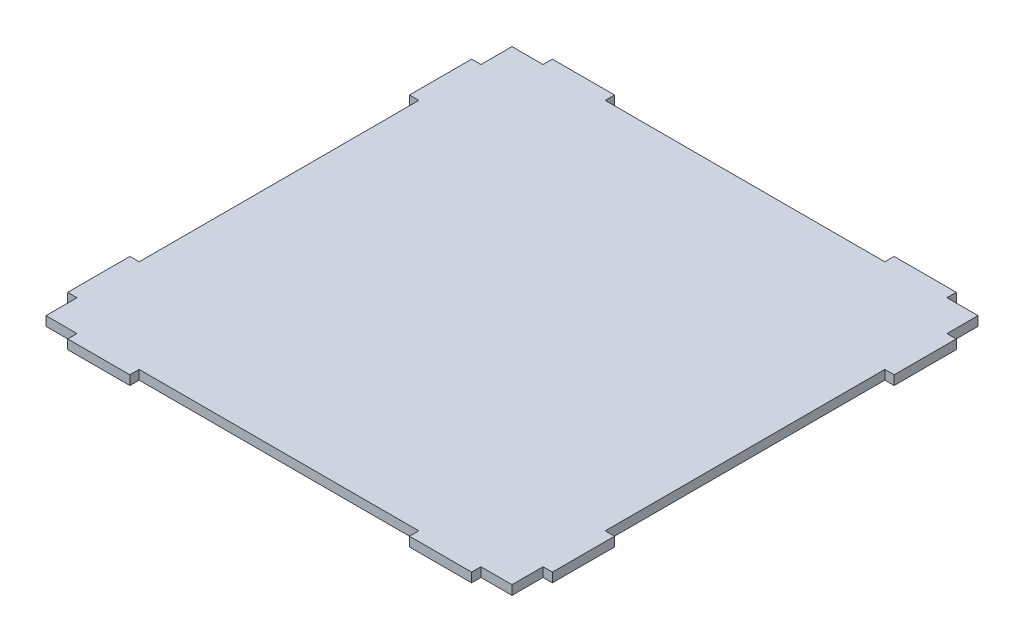
ISO-10303-21;
HEADER;
FILE_DESCRIPTION(('STEP AP214'),'2;1');
FILE_NAME('part.step','',(''),(''),'','','');
FILE_SCHEMA(('AUTOMOTIVE_DESIGN { 1 0 10303 214 1 1 1 1 }'));
ENDSEC;
DATA;
#1=APPLICATION_CONTEXT('core data for automotive mechanical design processes');
#2=APPLICATION_PROTOCOL_DEFINITION('international standard','automotive_design',2000,#1);
#3=PRODUCT_CONTEXT('',#1,'mechanical');
#4=PRODUCT('Part','Part','',(#3));
#5=PRODUCT_RELATED_PRODUCT_CATEGORY('part','',(#4));
#6=PRODUCT_DEFINITION_FORMATION('','',#4);
#7=PRODUCT_DEFINITION_CONTEXT('part definition',#1,'design');
#8=PRODUCT_DEFINITION('design','',#6,#7);
#9=PRODUCT_DEFINITION_SHAPE('','',#8);
#10=(LENGTH_UNIT() NAMED_UNIT(*) SI_UNIT(.MILLI.,.METRE.));
#11=(NAMED_UNIT(*) PLANE_ANGLE_UNIT() SI_UNIT($,.RADIAN.));
#12=(NAMED_UNIT(*) SI_UNIT($,.STERADIAN.) SOLID_ANGLE_UNIT());
#13=UNCERTAINTY_MEASURE_WITH_UNIT(LENGTH_MEASURE(1.E-05),#10,'distance_accuracy_value','');
#14=(GEOMETRIC_REPRESENTATION_CONTEXT(3) GLOBAL_UNCERTAINTY_ASSIGNED_CONTEXT((#13)) GLOBAL_UNIT_ASSIGNED_CONTEXT((#10,
#11,#12)) REPRESENTATION_CONTEXT('',''));
#15=CARTESIAN_POINT('',(0.,0.,0.));
#16=DIRECTION('',(0.,0.,1.));
#17=DIRECTION('',(1.,0.,0.));
#18=AXIS2_PLACEMENT_3D('',#15,#16,#17);
#19=CARTESIAN_POINT('',(0.,3.,0.));
#20=DIRECTION('',(-1.,0.,0.));
#21=DIRECTION('',(0.,0.,1.));
#22=AXIS2_PLACEMENT_3D('',#19,#20,#21);
#23=PLANE('',#22);
#24=DIRECTION('',(0.,0.,-1.));
#25=VECTOR('',#24,1.);
#26=CARTESIAN_POINT('',(0.,0.,0.));
#27=LINE('',#26,#25);
#28=CARTESIAN_POINT('',(0.,0.,-140.));
#29=VERTEX_POINT('',#28);
#30=CARTESIAN_POINT('',(0.,0.,-150.));
#31=VERTEX_POINT('',#30);
#32=EDGE_CURVE('E475',#29,#31,#27,.T.);
#33=ORIENTED_EDGE('',*,*,#32,.F.);
#34=DIRECTION('',(0.,-1.,0.));
#35=VECTOR('',#34,1.);
#36=CARTESIAN_POINT('',(0.,3.,-140.));
#37=LINE('',#36,#35);
#38=CARTESIAN_POINT('',(0.,3.,-140.));
#39=VERTEX_POINT('',#38);
#40=EDGE_CURVE('E49',#39,#29,#37,.T.);
#41=ORIENTED_EDGE('',*,*,#40,.F.);
#42=DIRECTION('',(0.,0.,-1.));
#43=VECTOR('',#42,1.);
#44=CARTESIAN_POINT('',(0.,3.,0.));
#45=LINE('',#44,#43);
#46=CARTESIAN_POINT('',(0.,3.,-150.));
#47=VERTEX_POINT('',#46);
#48=EDGE_CURVE('E480',#39,#47,#45,.T.);
#49=ORIENTED_EDGE('',*,*,#48,.T.);
#50=DIRECTION('',(0.,-1.,0.));
#51=VECTOR('',#50,1.);
#52=CARTESIAN_POINT('',(0.,3.,-150.));
#53=LINE('',#52,#51);
#54=EDGE_CURVE('E36',#47,#31,#53,.T.);
#55=ORIENTED_EDGE('',*,*,#54,.T.);
#56=EDGE_LOOP('',(#33,#41,#49,#55));
#57=FACE_BOUND('',#56,.T.);
#58=ADVANCED_FACE('F33',(#57),#23,.T.);
#59=CARTESIAN_POINT('',(0.,3.,-30.));
#60=VERTEX_POINT('',#59);
#61=CARTESIAN_POINT('',(0.,3.,-120.));
#62=VERTEX_POINT('',#61);
#63=EDGE_CURVE('E479',#60,#62,#45,.T.);
#64=ORIENTED_EDGE('',*,*,#63,.T.);
#65=DIRECTION('',(0.,1.,0.));
#66=VECTOR('',#65,1.);
#67=CARTESIAN_POINT('',(0.,3.,-120.));
#68=LINE('',#67,#66);
#69=CARTESIAN_POINT('',(0.,0.,-120.));
#70=VERTEX_POINT('',#69);
#71=EDGE_CURVE('E284',#70,#62,#68,.T.);
#72=ORIENTED_EDGE('',*,*,#71,.F.);
#73=CARTESIAN_POINT('',(0.,0.,-30.));
#74=VERTEX_POINT('',#73);
#75=EDGE_CURVE('E498',#74,#70,#27,.T.);
#76=ORIENTED_EDGE('',*,*,#75,.F.);
#77=DIRECTION('',(0.,-1.,0.));
#78=VECTOR('',#77,1.);
#79=CARTESIAN_POINT('',(0.,3.,-30.));
#80=LINE('',#79,#78);
#81=EDGE_CURVE('E453',#60,#74,#80,.T.);
#82=ORIENTED_EDGE('',*,*,#81,.F.);
#83=EDGE_LOOP('',(#64,#72,#76,#82));
#84=FACE_BOUND('',#83,.T.);
#85=ADVANCED_FACE('F532',(#84),#23,.T.);
#86=CARTESIAN_POINT('',(0.,3.,-150.));
#87=DIRECTION('',(0.,0.,-1.));
#88=DIRECTION('',(-1.,0.,0.));
#89=AXIS2_PLACEMENT_3D('',#86,#87,#88);
#90=PLANE('',#89);
#91=DIRECTION('',(1.,0.,0.));
#92=VECTOR('',#91,1.);
#93=CARTESIAN_POINT('',(0.,3.,-150.));
#94=LINE('',#93,#92);
#95=CARTESIAN_POINT('',(10.,3.,-150.));
#96=VERTEX_POINT('',#95);
#97=EDGE_CURVE('E481',#47,#96,#94,.T.);
#98=ORIENTED_EDGE('',*,*,#97,.T.);
#99=DIRECTION('',(0.,1.,0.));
#100=VECTOR('',#99,1.);
#101=CARTESIAN_POINT('',(10.,3.,-150.));
#102=LINE('',#101,#100);
#103=CARTESIAN_POINT('',(10.,0.,-150.));
#104=VERTEX_POINT('',#103);
#105=EDGE_CURVE('E287',#104,#96,#102,.T.);
#106=ORIENTED_EDGE('',*,*,#105,.F.);
#107=DIRECTION('',(1.,0.,0.));
#108=VECTOR('',#107,1.);
#109=CARTESIAN_POINT('',(0.,0.,-150.));
#110=LINE('',#109,#108);
#111=EDGE_CURVE('E499',#31,#104,#110,.T.);
#112=ORIENTED_EDGE('',*,*,#111,.F.);
#113=ORIENTED_EDGE('',*,*,#54,.F.);
#114=EDGE_LOOP('',(#98,#106,#112,#113));
#115=FACE_BOUND('',#114,.T.);
#116=ADVANCED_FACE('F524',(#115),#90,.T.);
#117=CARTESIAN_POINT('',(30.,0.,-150.));
#118=VERTEX_POINT('',#117);
#119=CARTESIAN_POINT('',(120.,0.,-150.));
#120=VERTEX_POINT('',#119);
#121=EDGE_CURVE('E503',#118,#120,#110,.T.);
#122=ORIENTED_EDGE('',*,*,#121,.F.);
#123=DIRECTION('',(0.,-1.,0.));
#124=VECTOR('',#123,1.);
#125=CARTESIAN_POINT('',(30.,3.,-150.));
#126=LINE('',#125,#124);
#127=CARTESIAN_POINT('',(30.,3.,-150.));
#128=VERTEX_POINT('',#127);
#129=EDGE_CURVE('E290',#128,#118,#126,.T.);
#130=ORIENTED_EDGE('',*,*,#129,.F.);
#131=CARTESIAN_POINT('',(120.,3.,-150.));
#132=VERTEX_POINT('',#131);
#133=EDGE_CURVE('E485',#128,#132,#94,.T.);
#134=ORIENTED_EDGE('',*,*,#133,.T.);
#135=DIRECTION('',(0.,1.,0.));
#136=VECTOR('',#135,1.);
#137=CARTESIAN_POINT('',(120.,3.,-150.));
#138=LINE('',#137,#136);
#139=EDGE_CURVE('E318',#120,#132,#138,.T.);
#140=ORIENTED_EDGE('',*,*,#139,.F.);
#141=EDGE_LOOP('',(#122,#130,#134,#140));
#142=FACE_BOUND('',#141,.T.);
#143=ADVANCED_FACE('F609',(#142),#90,.T.);
#144=DIRECTION('',(0.,-1.,0.));
#145=VECTOR('',#144,1.);
#146=CARTESIAN_POINT('',(140.,3.,-150.));
#147=LINE('',#146,#145);
#148=CARTESIAN_POINT('',(140.,3.,-150.));
#149=VERTEX_POINT('',#148);
#150=CARTESIAN_POINT('',(140.,0.,-150.));
#151=VERTEX_POINT('',#150);
#152=EDGE_CURVE('E313',#149,#151,#147,.T.);
#153=ORIENTED_EDGE('',*,*,#152,.F.);
#154=CARTESIAN_POINT('',(150.,3.,-150.));
#155=VERTEX_POINT('',#154);
#156=EDGE_CURVE('E478',#149,#155,#94,.T.);
#157=ORIENTED_EDGE('',*,*,#156,.T.);
#158=DIRECTION('',(0.,-1.,0.));
#159=VECTOR('',#158,1.);
#160=CARTESIAN_POINT('',(150.,3.,-150.));
#161=LINE('',#160,#159);
#162=CARTESIAN_POINT('',(150.,0.,-150.));
#163=VERTEX_POINT('',#162);
#164=EDGE_CURVE('E512',#155,#163,#161,.T.);
#165=ORIENTED_EDGE('',*,*,#164,.T.);
#166=EDGE_CURVE('E497',#151,#163,#110,.T.);
#167=ORIENTED_EDGE('',*,*,#166,.F.);
#168=EDGE_LOOP('',(#153,#157,#165,#167));
#169=FACE_BOUND('',#168,.T.);
#170=ADVANCED_FACE('F610',(#169),#90,.T.);
#171=CARTESIAN_POINT('',(150.,3.,0.));
#172=DIRECTION('',(-1.,0.,0.));
#173=DIRECTION('',(0.,0.,1.));
#174=AXIS2_PLACEMENT_3D('',#171,#172,#173);
#175=PLANE('',#174);
#176=DIRECTION('',(0.,1.,0.));
#177=VECTOR('',#176,1.);
#178=CARTESIAN_POINT('',(150.,3.,-140.));
#179=LINE('',#178,#177);
#180=CARTESIAN_POINT('',(150.,0.,-140.));
#181=VERTEX_POINT('',#180);
#182=CARTESIAN_POINT('',(150.,3.,-140.));
#183=VERTEX_POINT('',#182);
#184=EDGE_CURVE('E340',#181,#183,#179,.T.);
#185=ORIENTED_EDGE('',*,*,#184,.F.);
#186=DIRECTION('',(0.,0.,-1.));
#187=VECTOR('',#186,1.);
#188=CARTESIAN_POINT('',(150.,0.,0.));
#189=LINE('',#188,#187);
#190=EDGE_CURVE('E502',#181,#163,#189,.T.);
#191=ORIENTED_EDGE('',*,*,#190,.T.);
#192=ORIENTED_EDGE('',*,*,#164,.F.);
#193=DIRECTION('',(0.,0.,-1.));
#194=VECTOR('',#193,1.);
#195=CARTESIAN_POINT('',(150.,3.,0.));
#196=LINE('',#195,#194);
#197=EDGE_CURVE('E484',#183,#155,#196,.T.);
#198=ORIENTED_EDGE('',*,*,#197,.F.);
#199=EDGE_LOOP('',(#185,#191,#192,#198));
#200=FACE_BOUND('',#199,.T.);
#201=ADVANCED_FACE('F607',(#200),#175,.F.);
#202=DIRECTION('',(0.,-1.,0.));
#203=VECTOR('',#202,1.);
#204=CARTESIAN_POINT('',(150.,3.,-120.));
#205=LINE('',#204,#203);
#206=CARTESIAN_POINT('',(150.,3.,-120.));
#207=VERTEX_POINT('',#206);
#208=CARTESIAN_POINT('',(150.,0.,-120.));
#209=VERTEX_POINT('',#208);
#210=EDGE_CURVE('E345',#207,#209,#205,.T.);
#211=ORIENTED_EDGE('',*,*,#210,.F.);
#212=CARTESIAN_POINT('',(150.,3.,-30.));
#213=VERTEX_POINT('',#212);
#214=EDGE_CURVE('E490',#213,#207,#196,.T.);
#215=ORIENTED_EDGE('',*,*,#214,.F.);
#216=DIRECTION('',(0.,1.,0.));
#217=VECTOR('',#216,1.);
#218=CARTESIAN_POINT('',(150.,3.,-30.));
#219=LINE('',#218,#217);
#220=CARTESIAN_POINT('',(150.,0.,-30.));
#221=VERTEX_POINT('',#220);
#222=EDGE_CURVE('E372',#221,#213,#219,.T.);
#223=ORIENTED_EDGE('',*,*,#222,.F.);
#224=EDGE_CURVE('E507',#221,#209,#189,.T.);
#225=ORIENTED_EDGE('',*,*,#224,.T.);
#226=EDGE_LOOP('',(#211,#215,#223,#225));
#227=FACE_BOUND('',#226,.T.);
#228=ADVANCED_FACE('F605',(#227),#175,.F.);
#229=DIRECTION('',(0.,-1.,0.));
#230=VECTOR('',#229,1.);
#231=CARTESIAN_POINT('',(150.,3.,-10.));
#232=LINE('',#231,#230);
#233=CARTESIAN_POINT('',(150.,3.,-10.));
#234=VERTEX_POINT('',#233);
#235=CARTESIAN_POINT('',(150.,0.,-10.));
#236=VERTEX_POINT('',#235);
#237=EDGE_CURVE('E367',#234,#236,#232,.T.);
#238=ORIENTED_EDGE('',*,*,#237,.F.);
#239=CARTESIAN_POINT('',(150.,3.,0.));
#240=VERTEX_POINT('',#239);
#241=EDGE_CURVE('E486',#240,#234,#196,.T.);
#242=ORIENTED_EDGE('',*,*,#241,.F.);
#243=DIRECTION('',(0.,-1.,0.));
#244=VECTOR('',#243,1.);
#245=CARTESIAN_POINT('',(150.,3.,0.));
#246=LINE('',#245,#244);
#247=CARTESIAN_POINT('',(150.,0.,0.));
#248=VERTEX_POINT('',#247);
#249=EDGE_CURVE('E41',#240,#248,#246,.T.);
#250=ORIENTED_EDGE('',*,*,#249,.T.);
#251=EDGE_CURVE('E504',#248,#236,#189,.T.);
#252=ORIENTED_EDGE('',*,*,#251,.T.);
#253=EDGE_LOOP('',(#238,#242,#250,#252));
#254=FACE_BOUND('',#253,.T.);
#255=ADVANCED_FACE('F603',(#254),#175,.F.);
#256=CARTESIAN_POINT('',(0.,3.,0.));
#257=DIRECTION('',(0.,0.,-1.));
#258=DIRECTION('',(-1.,0.,0.));
#259=AXIS2_PLACEMENT_3D('',#256,#257,#258);
#260=PLANE('',#259);
#261=DIRECTION('',(0.,1.,0.));
#262=VECTOR('',#261,1.);
#263=CARTESIAN_POINT('',(140.,3.,0.));
#264=LINE('',#263,#262);
#265=CARTESIAN_POINT('',(140.,0.,0.));
#266=VERTEX_POINT('',#265);
#267=CARTESIAN_POINT('',(140.,3.,0.));
#268=VERTEX_POINT('',#267);
#269=EDGE_CURVE('E394',#266,#268,#264,.T.);
#270=ORIENTED_EDGE('',*,*,#269,.F.);
#271=DIRECTION('',(1.,0.,0.));
#272=VECTOR('',#271,1.);
#273=CARTESIAN_POINT('',(0.,0.,0.));
#274=LINE('',#273,#272);
#275=EDGE_CURVE('E506',#266,#248,#274,.T.);
#276=ORIENTED_EDGE('',*,*,#275,.T.);
#277=ORIENTED_EDGE('',*,*,#249,.F.);
#278=DIRECTION('',(1.,0.,0.));
#279=VECTOR('',#278,1.);
#280=CARTESIAN_POINT('',(0.,3.,0.));
#281=LINE('',#280,#279);
#282=EDGE_CURVE('E489',#268,#240,#281,.T.);
#283=ORIENTED_EDGE('',*,*,#282,.F.);
#284=EDGE_LOOP('',(#270,#276,#277,#283));
#285=FACE_BOUND('',#284,.T.);
#286=ADVANCED_FACE('F576',(#285),#260,.F.);
#287=DIRECTION('',(0.,-1.,0.));
#288=VECTOR('',#287,1.);
#289=CARTESIAN_POINT('',(120.,3.,0.));
#290=LINE('',#289,#288);
#291=CARTESIAN_POINT('',(120.,3.,0.));
#292=VERTEX_POINT('',#291);
#293=CARTESIAN_POINT('',(120.,0.,0.));
#294=VERTEX_POINT('',#293);
#295=EDGE_CURVE('E399',#292,#294,#290,.T.);
#296=ORIENTED_EDGE('',*,*,#295,.F.);
#297=CARTESIAN_POINT('',(30.,3.,0.));
#298=VERTEX_POINT('',#297);
#299=EDGE_CURVE('E494',#298,#292,#281,.T.);
#300=ORIENTED_EDGE('',*,*,#299,.F.);
#301=DIRECTION('',(0.,1.,0.));
#302=VECTOR('',#301,1.);
#303=CARTESIAN_POINT('',(30.,3.,0.));
#304=LINE('',#303,#302);
#305=CARTESIAN_POINT('',(30.,0.,0.));
#306=VERTEX_POINT('',#305);
#307=EDGE_CURVE('E426',#306,#298,#304,.T.);
#308=ORIENTED_EDGE('',*,*,#307,.F.);
#309=EDGE_CURVE('E509',#306,#294,#274,.T.);
#310=ORIENTED_EDGE('',*,*,#309,.T.);
#311=EDGE_LOOP('',(#296,#300,#308,#310));
#312=FACE_BOUND('',#311,.T.);
#313=ADVANCED_FACE('F573',(#312),#260,.F.);
#314=DIRECTION('',(0.,-1.,0.));
#315=VECTOR('',#314,1.);
#316=CARTESIAN_POINT('',(10.,3.,0.));
#317=LINE('',#316,#315);
#318=CARTESIAN_POINT('',(10.,3.,0.));
#319=VERTEX_POINT('',#318);
#320=CARTESIAN_POINT('',(10.,0.,0.));
#321=VERTEX_POINT('',#320);
#322=EDGE_CURVE('E421',#319,#321,#317,.T.);
#323=ORIENTED_EDGE('',*,*,#322,.F.);
#324=CARTESIAN_POINT('',(0.,3.,0.));
#325=VERTEX_POINT('',#324);
#326=EDGE_CURVE('E491',#325,#319,#281,.T.);
#327=ORIENTED_EDGE('',*,*,#326,.F.);
#328=DIRECTION('',(0.,-1.,0.));
#329=VECTOR('',#328,1.);
#330=CARTESIAN_POINT('',(0.,3.,0.));
#331=LINE('',#330,#329);
#332=CARTESIAN_POINT('',(0.,0.,0.));
#333=VERTEX_POINT('',#332);
#334=EDGE_CURVE('E11',#325,#333,#331,.T.);
#335=ORIENTED_EDGE('',*,*,#334,.T.);
#336=EDGE_CURVE('E508',#333,#321,#274,.T.);
#337=ORIENTED_EDGE('',*,*,#336,.T.);
#338=EDGE_LOOP('',(#323,#327,#335,#337));
#339=FACE_BOUND('',#338,.T.);
#340=ADVANCED_FACE('F566',(#339),#260,.F.);
#341=DIRECTION('',(0.,1.,0.));
#342=VECTOR('',#341,1.);
#343=CARTESIAN_POINT('',(0.,3.,-10.));
#344=LINE('',#343,#342);
#345=CARTESIAN_POINT('',(0.,0.,-10.));
#346=VERTEX_POINT('',#345);
#347=CARTESIAN_POINT('',(0.,3.,-10.));
#348=VERTEX_POINT('',#347);
#349=EDGE_CURVE('E448',#346,#348,#344,.T.);
#350=ORIENTED_EDGE('',*,*,#349,.F.);
#351=EDGE_CURVE('E495',#333,#346,#27,.T.);
#352=ORIENTED_EDGE('',*,*,#351,.F.);
#353=ORIENTED_EDGE('',*,*,#334,.F.);
#354=EDGE_CURVE('E476',#325,#348,#45,.T.);
#355=ORIENTED_EDGE('',*,*,#354,.T.);
#356=EDGE_LOOP('',(#350,#352,#353,#355));
#357=FACE_BOUND('',#356,.T.);
#358=ADVANCED_FACE('F561',(#357),#23,.T.);
#359=CARTESIAN_POINT('',(0.,3.,0.));
#360=DIRECTION('',(0.,-1.,0.));
#361=DIRECTION('',(0.,0.,-1.));
#362=AXIS2_PLACEMENT_3D('',#359,#360,#361);
#363=PLANE('',#362);
#364=ORIENTED_EDGE('',*,*,#354,.F.);
#365=ORIENTED_EDGE('',*,*,#326,.T.);
#366=DIRECTION('',(0.,0.,-1.));
#367=VECTOR('',#366,1.);
#368=CARTESIAN_POINT('',(10.,3.,3.));
#369=LINE('',#368,#367);
#370=CARTESIAN_POINT('',(10.,3.,3.));
#371=VERTEX_POINT('',#370);
#372=EDGE_CURVE('E432',#371,#319,#369,.T.);
#373=ORIENTED_EDGE('',*,*,#372,.F.);
#374=DIRECTION('',(-1.,0.,0.));
#375=VECTOR('',#374,1.);
#376=CARTESIAN_POINT('',(10.,3.,3.));
#377=LINE('',#376,#375);
#378=CARTESIAN_POINT('',(30.,3.,3.));
#379=VERTEX_POINT('',#378);
#380=EDGE_CURVE('E430',#379,#371,#377,.T.);
#381=ORIENTED_EDGE('',*,*,#380,.F.);
#382=DIRECTION('',(0.,0.,-1.));
#383=VECTOR('',#382,1.);
#384=CARTESIAN_POINT('',(30.,3.,3.));
#385=LINE('',#384,#383);
#386=EDGE_CURVE('E439',#379,#298,#385,.T.);
#387=ORIENTED_EDGE('',*,*,#386,.T.);
#388=ORIENTED_EDGE('',*,*,#299,.T.);
#389=DIRECTION('',(0.,0.,-1.));
#390=VECTOR('',#389,1.);
#391=CARTESIAN_POINT('',(120.,3.,3.));
#392=LINE('',#391,#390);
#393=CARTESIAN_POINT('',(120.,3.,3.));
#394=VERTEX_POINT('',#393);
#395=EDGE_CURVE('E415',#394,#292,#392,.T.);
#396=ORIENTED_EDGE('',*,*,#395,.F.);
#397=DIRECTION('',(-1.,0.,0.));
#398=VECTOR('',#397,1.);
#399=CARTESIAN_POINT('',(140.,3.,3.));
#400=LINE('',#399,#398);
#401=CARTESIAN_POINT('',(140.,3.,3.));
#402=VERTEX_POINT('',#401);
#403=EDGE_CURVE('E398',#402,#394,#400,.T.);
#404=ORIENTED_EDGE('',*,*,#403,.F.);
#405=DIRECTION('',(0.,0.,-1.));
#406=VECTOR('',#405,1.);
#407=CARTESIAN_POINT('',(140.,3.,3.));
#408=LINE('',#407,#406);
#409=EDGE_CURVE('E418',#402,#268,#408,.T.);
#410=ORIENTED_EDGE('',*,*,#409,.T.);
#411=ORIENTED_EDGE('',*,*,#282,.T.);
#412=ORIENTED_EDGE('',*,*,#241,.T.);
#413=DIRECTION('',(-1.,0.,0.));
#414=VECTOR('',#413,1.);
#415=CARTESIAN_POINT('',(153.,3.,-10.));
#416=LINE('',#415,#414);
#417=CARTESIAN_POINT('',(153.,3.,-10.));
#418=VERTEX_POINT('',#417);
#419=EDGE_CURVE('E378',#418,#234,#416,.T.);
#420=ORIENTED_EDGE('',*,*,#419,.F.);
#421=DIRECTION('',(0.,0.,1.));
#422=VECTOR('',#421,1.);
#423=CARTESIAN_POINT('',(153.,3.,-10.));
#424=LINE('',#423,#422);
#425=CARTESIAN_POINT('',(153.,3.,-30.));
#426=VERTEX_POINT('',#425);
#427=EDGE_CURVE('E376',#426,#418,#424,.T.);
#428=ORIENTED_EDGE('',*,*,#427,.F.);
#429=DIRECTION('',(-1.,0.,0.));
#430=VECTOR('',#429,1.);
#431=CARTESIAN_POINT('',(153.,3.,-30.));
#432=LINE('',#431,#430);
#433=EDGE_CURVE('E385',#426,#213,#432,.T.);
#434=ORIENTED_EDGE('',*,*,#433,.T.);
#435=ORIENTED_EDGE('',*,*,#214,.T.);
#436=DIRECTION('',(-1.,0.,0.));
#437=VECTOR('',#436,1.);
#438=CARTESIAN_POINT('',(153.,3.,-120.));
#439=LINE('',#438,#437);
#440=CARTESIAN_POINT('',(153.,3.,-120.));
#441=VERTEX_POINT('',#440);
#442=EDGE_CURVE('E361',#441,#207,#439,.T.);
#443=ORIENTED_EDGE('',*,*,#442,.F.);
#444=DIRECTION('',(0.,0.,1.));
#445=VECTOR('',#444,1.);
#446=CARTESIAN_POINT('',(153.,3.,-140.));
#447=LINE('',#446,#445);
#448=CARTESIAN_POINT('',(153.,3.,-140.));
#449=VERTEX_POINT('',#448);
#450=EDGE_CURVE('E344',#449,#441,#447,.T.);
#451=ORIENTED_EDGE('',*,*,#450,.F.);
#452=DIRECTION('',(-1.,0.,0.));
#453=VECTOR('',#452,1.);
#454=CARTESIAN_POINT('',(153.,3.,-140.));
#455=LINE('',#454,#453);
#456=EDGE_CURVE('E364',#449,#183,#455,.T.);
#457=ORIENTED_EDGE('',*,*,#456,.T.);
#458=ORIENTED_EDGE('',*,*,#197,.T.);
#459=ORIENTED_EDGE('',*,*,#156,.F.);
#460=DIRECTION('',(0.,0.,1.));
#461=VECTOR('',#460,1.);
#462=CARTESIAN_POINT('',(140.,3.,-153.));
#463=LINE('',#462,#461);
#464=CARTESIAN_POINT('',(140.,3.,-153.));
#465=VERTEX_POINT('',#464);
#466=EDGE_CURVE('E324',#465,#149,#463,.T.);
#467=ORIENTED_EDGE('',*,*,#466,.F.);
#468=DIRECTION('',(1.,0.,0.));
#469=VECTOR('',#468,1.);
#470=CARTESIAN_POINT('',(140.,3.,-153.));
#471=LINE('',#470,#469);
#472=CARTESIAN_POINT('',(120.,3.,-153.));
#473=VERTEX_POINT('',#472);
#474=EDGE_CURVE('E322',#473,#465,#471,.T.);
#475=ORIENTED_EDGE('',*,*,#474,.F.);
#476=DIRECTION('',(0.,0.,1.));
#477=VECTOR('',#476,1.);
#478=CARTESIAN_POINT('',(120.,3.,-153.));
#479=LINE('',#478,#477);
#480=EDGE_CURVE('E331',#473,#132,#479,.T.);
#481=ORIENTED_EDGE('',*,*,#480,.T.);
#482=ORIENTED_EDGE('',*,*,#133,.F.);
#483=DIRECTION('',(0.,0.,1.));
#484=VECTOR('',#483,1.);
#485=CARTESIAN_POINT('',(30.,3.,-153.));
#486=LINE('',#485,#484);
#487=CARTESIAN_POINT('',(30.,3.,-153.));
#488=VERTEX_POINT('',#487);
#489=EDGE_CURVE('E309',#488,#128,#486,.T.);
#490=ORIENTED_EDGE('',*,*,#489,.F.);
#491=DIRECTION('',(1.,0.,0.));
#492=VECTOR('',#491,1.);
#493=CARTESIAN_POINT('',(10.,3.,-153.));
#494=LINE('',#493,#492);
#495=CARTESIAN_POINT('',(10.,3.,-153.));
#496=VERTEX_POINT('',#495);
#497=EDGE_CURVE('E299',#496,#488,#494,.T.);
#498=ORIENTED_EDGE('',*,*,#497,.F.);
#499=DIRECTION('',(0.,0.,1.));
#500=VECTOR('',#499,1.);
#501=CARTESIAN_POINT('',(10.,3.,-153.));
#502=LINE('',#501,#500);
#503=EDGE_CURVE('E311',#496,#96,#502,.T.);
#504=ORIENTED_EDGE('',*,*,#503,.T.);
#505=ORIENTED_EDGE('',*,*,#97,.F.);
#506=ORIENTED_EDGE('',*,*,#48,.F.);
#507=DIRECTION('',(1.,0.,0.));
#508=VECTOR('',#507,1.);
#509=CARTESIAN_POINT('',(-3.,3.,-140.));
#510=LINE('',#509,#508);
#511=CARTESIAN_POINT('',(-3.,3.,-140.));
#512=VERTEX_POINT('',#511);
#513=EDGE_CURVE('E544',#512,#39,#510,.T.);
#514=ORIENTED_EDGE('',*,*,#513,.F.);
#515=DIRECTION('',(0.,0.,-1.));
#516=VECTOR('',#515,1.);
#517=CARTESIAN_POINT('',(-3.,3.,-140.));
#518=LINE('',#517,#516);
#519=CARTESIAN_POINT('',(-3.,3.,-120.));
#520=VERTEX_POINT('',#519);
#521=EDGE_CURVE('E282',#520,#512,#518,.T.);
#522=ORIENTED_EDGE('',*,*,#521,.F.);
#523=DIRECTION('',(1.,0.,0.));
#524=VECTOR('',#523,1.);
#525=CARTESIAN_POINT('',(-3.,3.,-120.));
#526=LINE('',#525,#524);
#527=EDGE_CURVE('E292',#520,#62,#526,.T.);
#528=ORIENTED_EDGE('',*,*,#527,.T.);
#529=ORIENTED_EDGE('',*,*,#63,.F.);
#530=DIRECTION('',(1.,0.,0.));
#531=VECTOR('',#530,1.);
#532=CARTESIAN_POINT('',(-3.,3.,-30.));
#533=LINE('',#532,#531);
#534=CARTESIAN_POINT('',(-3.,3.,-30.));
#535=VERTEX_POINT('',#534);
#536=EDGE_CURVE('E469',#535,#60,#533,.T.);
#537=ORIENTED_EDGE('',*,*,#536,.F.);
#538=DIRECTION('',(0.,0.,-1.));
#539=VECTOR('',#538,1.);
#540=CARTESIAN_POINT('',(-3.,3.,-10.));
#541=LINE('',#540,#539);
#542=CARTESIAN_POINT('',(-3.,3.,-10.));
#543=VERTEX_POINT('',#542);
#544=EDGE_CURVE('E452',#543,#535,#541,.T.);
#545=ORIENTED_EDGE('',*,*,#544,.F.);
#546=DIRECTION('',(1.,0.,0.));
#547=VECTOR('',#546,1.);
#548=CARTESIAN_POINT('',(-3.,3.,-10.));
#549=LINE('',#548,#547);
#550=EDGE_CURVE('E472',#543,#348,#549,.T.);
#551=ORIENTED_EDGE('',*,*,#550,.T.);
#552=EDGE_LOOP('',(#364,#365,#373,#381,#387,#388,#396,#404,#410,#411,#412,#420,#428,#434,#435,
#443,#451,#457,#458,#459,#467,#475,#481,#482,#490,#498,#504,#505,#506,#514,#522,#528,#529,#537,
#545,#551));
#553=FACE_BOUND('',#552,.T.);
#554=ADVANCED_FACE('F540',(#553),#363,.F.);
#555=CARTESIAN_POINT('',(0.,0.,0.));
#556=DIRECTION('',(0.,-1.,0.));
#557=DIRECTION('',(0.,0.,-1.));
#558=AXIS2_PLACEMENT_3D('',#555,#556,#557);
#559=PLANE('',#558);
#560=ORIENTED_EDGE('',*,*,#351,.T.);
#561=DIRECTION('',(1.,0.,0.));
#562=VECTOR('',#561,1.);
#563=CARTESIAN_POINT('',(-3.,0.,-10.));
#564=LINE('',#563,#562);
#565=CARTESIAN_POINT('',(-3.,0.,-10.));
#566=VERTEX_POINT('',#565);
#567=EDGE_CURVE('E459',#566,#346,#564,.T.);
#568=ORIENTED_EDGE('',*,*,#567,.F.);
#569=DIRECTION('',(0.,0.,1.));
#570=VECTOR('',#569,1.);
#571=CARTESIAN_POINT('',(-3.,0.,-10.));
#572=LINE('',#571,#570);
#573=CARTESIAN_POINT('',(-3.,0.,-30.));
#574=VERTEX_POINT('',#573);
#575=EDGE_CURVE('E457',#574,#566,#572,.T.);
#576=ORIENTED_EDGE('',*,*,#575,.F.);
#577=DIRECTION('',(1.,0.,0.));
#578=VECTOR('',#577,1.);
#579=CARTESIAN_POINT('',(-3.,0.,-30.));
#580=LINE('',#579,#578);
#581=EDGE_CURVE('E466',#574,#74,#580,.T.);
#582=ORIENTED_EDGE('',*,*,#581,.T.);
#583=ORIENTED_EDGE('',*,*,#75,.T.);
#584=DIRECTION('',(1.,0.,0.));
#585=VECTOR('',#584,1.);
#586=CARTESIAN_POINT('',(-3.,0.,-120.));
#587=LINE('',#586,#585);
#588=CARTESIAN_POINT('',(-3.,0.,-120.));
#589=VERTEX_POINT('',#588);
#590=EDGE_CURVE('E273',#589,#70,#587,.T.);
#591=ORIENTED_EDGE('',*,*,#590,.F.);
#592=DIRECTION('',(0.,0.,1.));
#593=VECTOR('',#592,1.);
#594=CARTESIAN_POINT('',(-3.,0.,-140.));
#595=LINE('',#594,#593);
#596=CARTESIAN_POINT('',(-3.,0.,-140.));
#597=VERTEX_POINT('',#596);
#598=EDGE_CURVE('E266',#597,#589,#595,.T.);
#599=ORIENTED_EDGE('',*,*,#598,.F.);
#600=DIRECTION('',(1.,0.,0.));
#601=VECTOR('',#600,1.);
#602=CARTESIAN_POINT('',(-3.,0.,-140.));
#603=LINE('',#602,#601);
#604=EDGE_CURVE('E270',#597,#29,#603,.T.);
#605=ORIENTED_EDGE('',*,*,#604,.T.);
#606=ORIENTED_EDGE('',*,*,#32,.T.);
#607=ORIENTED_EDGE('',*,*,#111,.T.);
#608=DIRECTION('',(0.,0.,1.));
#609=VECTOR('',#608,1.);
#610=CARTESIAN_POINT('',(10.,0.,-153.));
#611=LINE('',#610,#609);
#612=CARTESIAN_POINT('',(10.,0.,-153.));
#613=VERTEX_POINT('',#612);
#614=EDGE_CURVE('E304',#613,#104,#611,.T.);
#615=ORIENTED_EDGE('',*,*,#614,.F.);
#616=DIRECTION('',(-1.,0.,0.));
#617=VECTOR('',#616,1.);
#618=CARTESIAN_POINT('',(10.,0.,-153.));
#619=LINE('',#618,#617);
#620=CARTESIAN_POINT('',(30.,0.,-153.));
#621=VERTEX_POINT('',#620);
#622=EDGE_CURVE('E303',#621,#613,#619,.T.);
#623=ORIENTED_EDGE('',*,*,#622,.F.);
#624=DIRECTION('',(0.,0.,1.));
#625=VECTOR('',#624,1.);
#626=CARTESIAN_POINT('',(30.,0.,-153.));
#627=LINE('',#626,#625);
#628=EDGE_CURVE('E57',#621,#118,#627,.T.);
#629=ORIENTED_EDGE('',*,*,#628,.T.);
#630=ORIENTED_EDGE('',*,*,#121,.T.);
#631=DIRECTION('',(0.,0.,1.));
#632=VECTOR('',#631,1.);
#633=CARTESIAN_POINT('',(120.,0.,-153.));
#634=LINE('',#633,#632);
#635=CARTESIAN_POINT('',(120.,0.,-153.));
#636=VERTEX_POINT('',#635);
#637=EDGE_CURVE('E334',#636,#120,#634,.T.);
#638=ORIENTED_EDGE('',*,*,#637,.F.);
#639=DIRECTION('',(-1.,0.,0.));
#640=VECTOR('',#639,1.);
#641=CARTESIAN_POINT('',(140.,0.,-153.));
#642=LINE('',#641,#640);
#643=CARTESIAN_POINT('',(140.,0.,-153.));
#644=VERTEX_POINT('',#643);
#645=EDGE_CURVE('E317',#644,#636,#642,.T.);
#646=ORIENTED_EDGE('',*,*,#645,.F.);
#647=DIRECTION('',(0.,0.,1.));
#648=VECTOR('',#647,1.);
#649=CARTESIAN_POINT('',(140.,0.,-153.));
#650=LINE('',#649,#648);
#651=EDGE_CURVE('E337',#644,#151,#650,.T.);
#652=ORIENTED_EDGE('',*,*,#651,.T.);
#653=ORIENTED_EDGE('',*,*,#166,.T.);
#654=ORIENTED_EDGE('',*,*,#190,.F.);
#655=DIRECTION('',(-1.,0.,0.));
#656=VECTOR('',#655,1.);
#657=CARTESIAN_POINT('',(153.,0.,-140.));
#658=LINE('',#657,#656);
#659=CARTESIAN_POINT('',(153.,0.,-140.));
#660=VERTEX_POINT('',#659);
#661=EDGE_CURVE('E351',#660,#181,#658,.T.);
#662=ORIENTED_EDGE('',*,*,#661,.F.);
#663=DIRECTION('',(0.,0.,-1.));
#664=VECTOR('',#663,1.);
#665=CARTESIAN_POINT('',(153.,0.,-140.));
#666=LINE('',#665,#664);
#667=CARTESIAN_POINT('',(153.,0.,-120.));
#668=VERTEX_POINT('',#667);
#669=EDGE_CURVE('E349',#668,#660,#666,.T.);
#670=ORIENTED_EDGE('',*,*,#669,.F.);
#671=DIRECTION('',(-1.,0.,0.));
#672=VECTOR('',#671,1.);
#673=CARTESIAN_POINT('',(153.,0.,-120.));
#674=LINE('',#673,#672);
#675=EDGE_CURVE('E358',#668,#209,#674,.T.);
#676=ORIENTED_EDGE('',*,*,#675,.T.);
#677=ORIENTED_EDGE('',*,*,#224,.F.);
#678=DIRECTION('',(-1.,0.,0.));
#679=VECTOR('',#678,1.);
#680=CARTESIAN_POINT('',(153.,0.,-30.));
#681=LINE('',#680,#679);
#682=CARTESIAN_POINT('',(153.,0.,-30.));
#683=VERTEX_POINT('',#682);
#684=EDGE_CURVE('E388',#683,#221,#681,.T.);
#685=ORIENTED_EDGE('',*,*,#684,.F.);
#686=DIRECTION('',(0.,0.,-1.));
#687=VECTOR('',#686,1.);
#688=CARTESIAN_POINT('',(153.,0.,-10.));
#689=LINE('',#688,#687);
#690=CARTESIAN_POINT('',(153.,0.,-10.));
#691=VERTEX_POINT('',#690);
#692=EDGE_CURVE('E371',#691,#683,#689,.T.);
#693=ORIENTED_EDGE('',*,*,#692,.F.);
#694=DIRECTION('',(-1.,0.,0.));
#695=VECTOR('',#694,1.);
#696=CARTESIAN_POINT('',(153.,0.,-10.));
#697=LINE('',#696,#695);
#698=EDGE_CURVE('E391',#691,#236,#697,.T.);
#699=ORIENTED_EDGE('',*,*,#698,.T.);
#700=ORIENTED_EDGE('',*,*,#251,.F.);
#701=ORIENTED_EDGE('',*,*,#275,.F.);
#702=DIRECTION('',(0.,0.,-1.));
#703=VECTOR('',#702,1.);
#704=CARTESIAN_POINT('',(140.,0.,3.));
#705=LINE('',#704,#703);
#706=CARTESIAN_POINT('',(140.,0.,3.));
#707=VERTEX_POINT('',#706);
#708=EDGE_CURVE('E405',#707,#266,#705,.T.);
#709=ORIENTED_EDGE('',*,*,#708,.F.);
#710=DIRECTION('',(1.,0.,0.));
#711=VECTOR('',#710,1.);
#712=CARTESIAN_POINT('',(140.,0.,3.));
#713=LINE('',#712,#711);
#714=CARTESIAN_POINT('',(120.,0.,3.));
#715=VERTEX_POINT('',#714);
#716=EDGE_CURVE('E403',#715,#707,#713,.T.);
#717=ORIENTED_EDGE('',*,*,#716,.F.);
#718=DIRECTION('',(0.,0.,-1.));
#719=VECTOR('',#718,1.);
#720=CARTESIAN_POINT('',(120.,0.,3.));
#721=LINE('',#720,#719);
#722=EDGE_CURVE('E412',#715,#294,#721,.T.);
#723=ORIENTED_EDGE('',*,*,#722,.T.);
#724=ORIENTED_EDGE('',*,*,#309,.F.);
#725=DIRECTION('',(0.,0.,-1.));
#726=VECTOR('',#725,1.);
#727=CARTESIAN_POINT('',(30.,0.,3.));
#728=LINE('',#727,#726);
#729=CARTESIAN_POINT('',(30.,0.,3.));
#730=VERTEX_POINT('',#729);
#731=EDGE_CURVE('E442',#730,#306,#728,.T.);
#732=ORIENTED_EDGE('',*,*,#731,.F.);
#733=DIRECTION('',(1.,0.,0.));
#734=VECTOR('',#733,1.);
#735=CARTESIAN_POINT('',(10.,0.,3.));
#736=LINE('',#735,#734);
#737=CARTESIAN_POINT('',(10.,0.,3.));
#738=VERTEX_POINT('',#737);
#739=EDGE_CURVE('E425',#738,#730,#736,.T.);
#740=ORIENTED_EDGE('',*,*,#739,.F.);
#741=DIRECTION('',(0.,0.,-1.));
#742=VECTOR('',#741,1.);
#743=CARTESIAN_POINT('',(10.,0.,3.));
#744=LINE('',#743,#742);
#745=EDGE_CURVE('E445',#738,#321,#744,.T.);
#746=ORIENTED_EDGE('',*,*,#745,.T.);
#747=ORIENTED_EDGE('',*,*,#336,.F.);
#748=EDGE_LOOP('',(#560,#568,#576,#582,#583,#591,#599,#605,#606,#607,#615,#623,#629,#630,#638,
#646,#652,#653,#654,#662,#670,#676,#677,#685,#693,#699,#700,#701,#709,#717,#723,#724,#732,#740,
#746,#747));
#749=FACE_BOUND('',#748,.T.);
#750=ADVANCED_FACE('F269',(#749),#559,.T.);
#751=CARTESIAN_POINT('',(-3.,3.,-10.));
#752=DIRECTION('',(0.,0.,-1.));
#753=DIRECTION('',(-1.,0.,0.));
#754=AXIS2_PLACEMENT_3D('',#751,#752,#753);
#755=PLANE('',#754);
#756=ORIENTED_EDGE('',*,*,#349,.T.);
#757=ORIENTED_EDGE('',*,*,#550,.F.);
#758=DIRECTION('',(0.,1.,0.));
#759=VECTOR('',#758,1.);
#760=CARTESIAN_POINT('',(-3.,3.,-10.));
#761=LINE('',#760,#759);
#762=EDGE_CURVE('E449',#566,#543,#761,.T.);
#763=ORIENTED_EDGE('',*,*,#762,.F.);
#764=ORIENTED_EDGE('',*,*,#567,.T.);
#765=EDGE_LOOP('',(#756,#757,#763,#764));
#766=FACE_BOUND('',#765,.T.);
#767=ADVANCED_FACE('F583',(#766),#755,.F.);
#768=CARTESIAN_POINT('',(-3.,3.,-30.));
#769=DIRECTION('',(0.,0.,1.));
#770=DIRECTION('',(1.,0.,0.));
#771=AXIS2_PLACEMENT_3D('',#768,#769,#770);
#772=PLANE('',#771);
#773=ORIENTED_EDGE('',*,*,#81,.T.);
#774=ORIENTED_EDGE('',*,*,#581,.F.);
#775=DIRECTION('',(0.,-1.,0.));
#776=VECTOR('',#775,1.);
#777=CARTESIAN_POINT('',(-3.,3.,-30.));
#778=LINE('',#777,#776);
#779=EDGE_CURVE('E455',#535,#574,#778,.T.);
#780=ORIENTED_EDGE('',*,*,#779,.F.);
#781=ORIENTED_EDGE('',*,*,#536,.T.);
#782=EDGE_LOOP('',(#773,#774,#780,#781));
#783=FACE_BOUND('',#782,.T.);
#784=ADVANCED_FACE('F535',(#783),#772,.F.);
#785=CARTESIAN_POINT('',(-3.,0.,0.));
#786=DIRECTION('',(1.,0.,0.));
#787=DIRECTION('',(0.,0.,-1.));
#788=AXIS2_PLACEMENT_3D('',#785,#786,#787);
#789=PLANE('',#788);
#790=ORIENTED_EDGE('',*,*,#762,.T.);
#791=ORIENTED_EDGE('',*,*,#544,.T.);
#792=ORIENTED_EDGE('',*,*,#779,.T.);
#793=ORIENTED_EDGE('',*,*,#575,.T.);
#794=EDGE_LOOP('',(#790,#791,#792,#793));
#795=FACE_BOUND('',#794,.T.);
#796=ADVANCED_FACE('F585',(#795),#789,.F.);
#797=CARTESIAN_POINT('',(10.,3.,3.));
#798=DIRECTION('',(1.,0.,0.));
#799=DIRECTION('',(0.,1.,0.));
#800=AXIS2_PLACEMENT_3D('',#797,#798,#799);
#801=PLANE('',#800);
#802=ORIENTED_EDGE('',*,*,#322,.T.);
#803=ORIENTED_EDGE('',*,*,#745,.F.);
#804=DIRECTION('',(0.,-1.,0.));
#805=VECTOR('',#804,1.);
#806=CARTESIAN_POINT('',(10.,3.,3.));
#807=LINE('',#806,#805);
#808=EDGE_CURVE('E422',#371,#738,#807,.T.);
#809=ORIENTED_EDGE('',*,*,#808,.F.);
#810=ORIENTED_EDGE('',*,*,#372,.T.);
#811=EDGE_LOOP('',(#802,#803,#809,#810));
#812=FACE_BOUND('',#811,.T.);
#813=ADVANCED_FACE('F587',(#812),#801,.F.);
#814=CARTESIAN_POINT('',(30.,3.,3.));
#815=DIRECTION('',(-1.,0.,0.));
#816=DIRECTION('',(0.,0.,1.));
#817=AXIS2_PLACEMENT_3D('',#814,#815,#816);
#818=PLANE('',#817);
#819=ORIENTED_EDGE('',*,*,#307,.T.);
#820=ORIENTED_EDGE('',*,*,#386,.F.);
#821=DIRECTION('',(0.,1.,0.));
#822=VECTOR('',#821,1.);
#823=CARTESIAN_POINT('',(30.,3.,3.));
#824=LINE('',#823,#822);
#825=EDGE_CURVE('E428',#730,#379,#824,.T.);
#826=ORIENTED_EDGE('',*,*,#825,.F.);
#827=ORIENTED_EDGE('',*,*,#731,.T.);
#828=EDGE_LOOP('',(#819,#820,#826,#827));
#829=FACE_BOUND('',#828,.T.);
#830=ADVANCED_FACE('F593',(#829),#818,.F.);
#831=CARTESIAN_POINT('',(0.,0.,3.));
#832=DIRECTION('',(0.,0.,1.));
#833=DIRECTION('',(1.,0.,0.));
#834=AXIS2_PLACEMENT_3D('',#831,#832,#833);
#835=PLANE('',#834);
#836=ORIENTED_EDGE('',*,*,#808,.T.);
#837=ORIENTED_EDGE('',*,*,#739,.T.);
#838=ORIENTED_EDGE('',*,*,#825,.T.);
#839=ORIENTED_EDGE('',*,*,#380,.T.);
#840=EDGE_LOOP('',(#836,#837,#838,#839));
#841=FACE_BOUND('',#840,.T.);
#842=ADVANCED_FACE('F696',(#841),#835,.T.);
#843=CARTESIAN_POINT('',(140.,3.,3.));
#844=DIRECTION('',(-1.,0.,0.));
#845=DIRECTION('',(0.,0.,1.));
#846=AXIS2_PLACEMENT_3D('',#843,#844,#845);
#847=PLANE('',#846);
#848=ORIENTED_EDGE('',*,*,#269,.T.);
#849=ORIENTED_EDGE('',*,*,#409,.F.);
#850=DIRECTION('',(0.,1.,0.));
#851=VECTOR('',#850,1.);
#852=CARTESIAN_POINT('',(140.,3.,3.));
#853=LINE('',#852,#851);
#854=EDGE_CURVE('E395',#707,#402,#853,.T.);
#855=ORIENTED_EDGE('',*,*,#854,.F.);
#856=ORIENTED_EDGE('',*,*,#708,.T.);
#857=EDGE_LOOP('',(#848,#849,#855,#856));
#858=FACE_BOUND('',#857,.T.);
#859=ADVANCED_FACE('F692',(#858),#847,.F.);
#860=CARTESIAN_POINT('',(120.,3.,3.));
#861=DIRECTION('',(1.,0.,0.));
#862=DIRECTION('',(0.,0.,-1.));
#863=AXIS2_PLACEMENT_3D('',#860,#861,#862);
#864=PLANE('',#863);
#865=ORIENTED_EDGE('',*,*,#295,.T.);
#866=ORIENTED_EDGE('',*,*,#722,.F.);
#867=DIRECTION('',(0.,-1.,0.));
#868=VECTOR('',#867,1.);
#869=CARTESIAN_POINT('',(120.,3.,3.));
#870=LINE('',#869,#868);
#871=EDGE_CURVE('E401',#394,#715,#870,.T.);
#872=ORIENTED_EDGE('',*,*,#871,.F.);
#873=ORIENTED_EDGE('',*,*,#395,.T.);
#874=EDGE_LOOP('',(#865,#866,#872,#873));
#875=FACE_BOUND('',#874,.T.);
#876=ADVANCED_FACE('F688',(#875),#864,.F.);
#877=CARTESIAN_POINT('',(0.,0.,3.));
#878=DIRECTION('',(0.,0.,-1.));
#879=DIRECTION('',(-1.,0.,0.));
#880=AXIS2_PLACEMENT_3D('',#877,#878,#879);
#881=PLANE('',#880);
#882=ORIENTED_EDGE('',*,*,#854,.T.);
#883=ORIENTED_EDGE('',*,*,#403,.T.);
#884=ORIENTED_EDGE('',*,*,#871,.T.);
#885=ORIENTED_EDGE('',*,*,#716,.T.);
#886=EDGE_LOOP('',(#882,#883,#884,#885));
#887=FACE_BOUND('',#886,.T.);
#888=ADVANCED_FACE('F684',(#887),#881,.F.);
#889=CARTESIAN_POINT('',(153.,3.,-10.));
#890=DIRECTION('',(0.,0.,-1.));
#891=DIRECTION('',(-1.,0.,0.));
#892=AXIS2_PLACEMENT_3D('',#889,#890,#891);
#893=PLANE('',#892);
#894=ORIENTED_EDGE('',*,*,#237,.T.);
#895=ORIENTED_EDGE('',*,*,#698,.F.);
#896=DIRECTION('',(0.,-1.,0.));
#897=VECTOR('',#896,1.);
#898=CARTESIAN_POINT('',(153.,3.,-10.));
#899=LINE('',#898,#897);
#900=EDGE_CURVE('E368',#418,#691,#899,.T.);
#901=ORIENTED_EDGE('',*,*,#900,.F.);
#902=ORIENTED_EDGE('',*,*,#419,.T.);
#903=EDGE_LOOP('',(#894,#895,#901,#902));
#904=FACE_BOUND('',#903,.T.);
#905=ADVANCED_FACE('F680',(#904),#893,.F.);
#906=CARTESIAN_POINT('',(153.,3.,-30.));
#907=DIRECTION('',(0.,0.,1.));
#908=DIRECTION('',(1.,0.,0.));
#909=AXIS2_PLACEMENT_3D('',#906,#907,#908);
#910=PLANE('',#909);
#911=ORIENTED_EDGE('',*,*,#222,.T.);
#912=ORIENTED_EDGE('',*,*,#433,.F.);
#913=DIRECTION('',(0.,1.,0.));
#914=VECTOR('',#913,1.);
#915=CARTESIAN_POINT('',(153.,3.,-30.));
#916=LINE('',#915,#914);
#917=EDGE_CURVE('E374',#683,#426,#916,.T.);
#918=ORIENTED_EDGE('',*,*,#917,.F.);
#919=ORIENTED_EDGE('',*,*,#684,.T.);
#920=EDGE_LOOP('',(#911,#912,#918,#919));
#921=FACE_BOUND('',#920,.T.);
#922=ADVANCED_FACE('F676',(#921),#910,.F.);
#923=CARTESIAN_POINT('',(153.,0.,0.));
#924=DIRECTION('',(1.,0.,0.));
#925=DIRECTION('',(0.,0.,-1.));
#926=AXIS2_PLACEMENT_3D('',#923,#924,#925);
#927=PLANE('',#926);
#928=ORIENTED_EDGE('',*,*,#900,.T.);
#929=ORIENTED_EDGE('',*,*,#692,.T.);
#930=ORIENTED_EDGE('',*,*,#917,.T.);
#931=ORIENTED_EDGE('',*,*,#427,.T.);
#932=EDGE_LOOP('',(#928,#929,#930,#931));
#933=FACE_BOUND('',#932,.T.);
#934=ADVANCED_FACE('F672',(#933),#927,.T.);
#935=CARTESIAN_POINT('',(153.,3.,-140.));
#936=DIRECTION('',(0.,0.,1.));
#937=DIRECTION('',(1.,0.,0.));
#938=AXIS2_PLACEMENT_3D('',#935,#936,#937);
#939=PLANE('',#938);
#940=ORIENTED_EDGE('',*,*,#184,.T.);
#941=ORIENTED_EDGE('',*,*,#456,.F.);
#942=DIRECTION('',(0.,1.,0.));
#943=VECTOR('',#942,1.);
#944=CARTESIAN_POINT('',(153.,3.,-140.));
#945=LINE('',#944,#943);
#946=EDGE_CURVE('E341',#660,#449,#945,.T.);
#947=ORIENTED_EDGE('',*,*,#946,.F.);
#948=ORIENTED_EDGE('',*,*,#661,.T.);
#949=EDGE_LOOP('',(#940,#941,#947,#948));
#950=FACE_BOUND('',#949,.T.);
#951=ADVANCED_FACE('F668',(#950),#939,.F.);
#952=CARTESIAN_POINT('',(153.,3.,-120.));
#953=DIRECTION('',(0.,0.,-1.));
#954=DIRECTION('',(-1.,0.,0.));
#955=AXIS2_PLACEMENT_3D('',#952,#953,#954);
#956=PLANE('',#955);
#957=ORIENTED_EDGE('',*,*,#210,.T.);
#958=ORIENTED_EDGE('',*,*,#675,.F.);
#959=DIRECTION('',(0.,-1.,0.));
#960=VECTOR('',#959,1.);
#961=CARTESIAN_POINT('',(153.,3.,-120.));
#962=LINE('',#961,#960);
#963=EDGE_CURVE('E347',#441,#668,#962,.T.);
#964=ORIENTED_EDGE('',*,*,#963,.F.);
#965=ORIENTED_EDGE('',*,*,#442,.T.);
#966=EDGE_LOOP('',(#957,#958,#964,#965));
#967=FACE_BOUND('',#966,.T.);
#968=ADVANCED_FACE('F664',(#967),#956,.F.);
#969=CARTESIAN_POINT('',(153.,0.,0.));
#970=DIRECTION('',(-1.,0.,0.));
#971=DIRECTION('',(0.,0.,1.));
#972=AXIS2_PLACEMENT_3D('',#969,#970,#971);
#973=PLANE('',#972);
#974=ORIENTED_EDGE('',*,*,#946,.T.);
#975=ORIENTED_EDGE('',*,*,#450,.T.);
#976=ORIENTED_EDGE('',*,*,#963,.T.);
#977=ORIENTED_EDGE('',*,*,#669,.T.);
#978=EDGE_LOOP('',(#974,#975,#976,#977));
#979=FACE_BOUND('',#978,.T.);
#980=ADVANCED_FACE('F661',(#979),#973,.F.);
#981=CARTESIAN_POINT('',(140.,3.,-153.));
#982=DIRECTION('',(-1.,0.,0.));
#983=DIRECTION('',(0.,0.,1.));
#984=AXIS2_PLACEMENT_3D('',#981,#982,#983);
#985=PLANE('',#984);
#986=ORIENTED_EDGE('',*,*,#152,.T.);
#987=ORIENTED_EDGE('',*,*,#651,.F.);
#988=DIRECTION('',(0.,-1.,0.));
#989=VECTOR('',#988,1.);
#990=CARTESIAN_POINT('',(140.,3.,-153.));
#991=LINE('',#990,#989);
#992=EDGE_CURVE('E314',#465,#644,#991,.T.);
#993=ORIENTED_EDGE('',*,*,#992,.F.);
#994=ORIENTED_EDGE('',*,*,#466,.T.);
#995=EDGE_LOOP('',(#986,#987,#993,#994));
#996=FACE_BOUND('',#995,.T.);
#997=ADVANCED_FACE('F627',(#996),#985,.F.);
#998=CARTESIAN_POINT('',(120.,3.,-153.));
#999=DIRECTION('',(1.,0.,0.));
#1000=DIRECTION('',(0.,0.,-1.));
#1001=AXIS2_PLACEMENT_3D('',#998,#999,#1000);
#1002=PLANE('',#1001);
#1003=ORIENTED_EDGE('',*,*,#139,.T.);
#1004=ORIENTED_EDGE('',*,*,#480,.F.);
#1005=DIRECTION('',(0.,1.,0.));
#1006=VECTOR('',#1005,1.);
#1007=CARTESIAN_POINT('',(120.,3.,-153.));
#1008=LINE('',#1007,#1006);
#1009=EDGE_CURVE('E320',#636,#473,#1008,.T.);
#1010=ORIENTED_EDGE('',*,*,#1009,.F.);
#1011=ORIENTED_EDGE('',*,*,#637,.T.);
#1012=EDGE_LOOP('',(#1003,#1004,#1010,#1011));
#1013=FACE_BOUND('',#1012,.T.);
#1014=ADVANCED_FACE('F636',(#1013),#1002,.F.);
#1015=CARTESIAN_POINT('',(0.,0.,-153.));
#1016=DIRECTION('',(0.,0.,-1.));
#1017=DIRECTION('',(-1.,0.,0.));
#1018=AXIS2_PLACEMENT_3D('',#1015,#1016,#1017);
#1019=PLANE('',#1018);
#1020=ORIENTED_EDGE('',*,*,#992,.T.);
#1021=ORIENTED_EDGE('',*,*,#645,.T.);
#1022=ORIENTED_EDGE('',*,*,#1009,.T.);
#1023=ORIENTED_EDGE('',*,*,#474,.T.);
#1024=EDGE_LOOP('',(#1020,#1021,#1022,#1023));
#1025=FACE_BOUND('',#1024,.T.);
#1026=ADVANCED_FACE('F629',(#1025),#1019,.T.);
#1027=CARTESIAN_POINT('',(10.,3.,-153.));
#1028=DIRECTION('',(1.,0.,0.));
#1029=DIRECTION('',(0.,1.,0.));
#1030=AXIS2_PLACEMENT_3D('',#1027,#1028,#1029);
#1031=PLANE('',#1030);
#1032=ORIENTED_EDGE('',*,*,#105,.T.);
#1033=ORIENTED_EDGE('',*,*,#503,.F.);
#1034=DIRECTION('',(0.,1.,0.));
#1035=VECTOR('',#1034,1.);
#1036=CARTESIAN_POINT('',(10.,3.,-153.));
#1037=LINE('',#1036,#1035);
#1038=EDGE_CURVE('E296',#613,#496,#1037,.T.);
#1039=ORIENTED_EDGE('',*,*,#1038,.F.);
#1040=ORIENTED_EDGE('',*,*,#614,.T.);
#1041=EDGE_LOOP('',(#1032,#1033,#1039,#1040));
#1042=FACE_BOUND('',#1041,.T.);
#1043=ADVANCED_FACE('F646',(#1042),#1031,.F.);
#1044=CARTESIAN_POINT('',(30.,3.,-153.));
#1045=DIRECTION('',(-1.,0.,0.));
#1046=DIRECTION('',(0.,0.,1.));
#1047=AXIS2_PLACEMENT_3D('',#1044,#1045,#1046);
#1048=PLANE('',#1047);
#1049=ORIENTED_EDGE('',*,*,#129,.T.);
#1050=ORIENTED_EDGE('',*,*,#628,.F.);
#1051=DIRECTION('',(0.,-1.,0.));
#1052=VECTOR('',#1051,1.);
#1053=CARTESIAN_POINT('',(30.,3.,-153.));
#1054=LINE('',#1053,#1052);
#1055=EDGE_CURVE('E301',#488,#621,#1054,.T.);
#1056=ORIENTED_EDGE('',*,*,#1055,.F.);
#1057=ORIENTED_EDGE('',*,*,#489,.T.);
#1058=EDGE_LOOP('',(#1049,#1050,#1056,#1057));
#1059=FACE_BOUND('',#1058,.T.);
#1060=ADVANCED_FACE('F641',(#1059),#1048,.F.);
#1061=CARTESIAN_POINT('',(0.,0.,-153.));
#1062=DIRECTION('',(0.,0.,1.));
#1063=DIRECTION('',(1.,0.,0.));
#1064=AXIS2_PLACEMENT_3D('',#1061,#1062,#1063);
#1065=PLANE('',#1064);
#1066=ORIENTED_EDGE('',*,*,#1038,.T.);
#1067=ORIENTED_EDGE('',*,*,#497,.T.);
#1068=ORIENTED_EDGE('',*,*,#1055,.T.);
#1069=ORIENTED_EDGE('',*,*,#622,.T.);
#1070=EDGE_LOOP('',(#1066,#1067,#1068,#1069));
#1071=FACE_BOUND('',#1070,.T.);
#1072=ADVANCED_FACE('F558',(#1071),#1065,.F.);
#1073=CARTESIAN_POINT('',(-3.,3.,-140.));
#1074=DIRECTION('',(0.,0.,1.));
#1075=DIRECTION('',(1.,0.,0.));
#1076=AXIS2_PLACEMENT_3D('',#1073,#1074,#1075);
#1077=PLANE('',#1076);
#1078=ORIENTED_EDGE('',*,*,#40,.T.);
#1079=ORIENTED_EDGE('',*,*,#604,.F.);
#1080=DIRECTION('',(0.,-1.,0.));
#1081=VECTOR('',#1080,1.);
#1082=CARTESIAN_POINT('',(-3.,3.,-140.));
#1083=LINE('',#1082,#1081);
#1084=EDGE_CURVE('E277',#512,#597,#1083,.T.);
#1085=ORIENTED_EDGE('',*,*,#1084,.F.);
#1086=ORIENTED_EDGE('',*,*,#513,.T.);
#1087=EDGE_LOOP('',(#1078,#1079,#1085,#1086));
#1088=FACE_BOUND('',#1087,.T.);
#1089=ADVANCED_FACE('F286',(#1088),#1077,.F.);
#1090=CARTESIAN_POINT('',(-3.,3.,-120.));
#1091=DIRECTION('',(0.,0.,-1.));
#1092=DIRECTION('',(-1.,0.,0.));
#1093=AXIS2_PLACEMENT_3D('',#1090,#1091,#1092);
#1094=PLANE('',#1093);
#1095=ORIENTED_EDGE('',*,*,#71,.T.);
#1096=ORIENTED_EDGE('',*,*,#527,.F.);
#1097=DIRECTION('',(0.,1.,0.));
#1098=VECTOR('',#1097,1.);
#1099=CARTESIAN_POINT('',(-3.,3.,-120.));
#1100=LINE('',#1099,#1098);
#1101=EDGE_CURVE('E276',#589,#520,#1100,.T.);
#1102=ORIENTED_EDGE('',*,*,#1101,.F.);
#1103=ORIENTED_EDGE('',*,*,#590,.T.);
#1104=EDGE_LOOP('',(#1095,#1096,#1102,#1103));
#1105=FACE_BOUND('',#1104,.T.);
#1106=ADVANCED_FACE('F550',(#1105),#1094,.F.);
#1107=CARTESIAN_POINT('',(-3.,0.,0.));
#1108=DIRECTION('',(-1.,0.,0.));
#1109=DIRECTION('',(0.,0.,1.));
#1110=AXIS2_PLACEMENT_3D('',#1107,#1108,#1109);
#1111=PLANE('',#1110);
#1112=ORIENTED_EDGE('',*,*,#1084,.T.);
#1113=ORIENTED_EDGE('',*,*,#598,.T.);
#1114=ORIENTED_EDGE('',*,*,#1101,.T.);
#1115=ORIENTED_EDGE('',*,*,#521,.T.);
#1116=EDGE_LOOP('',(#1112,#1113,#1114,#1115));
#1117=FACE_BOUND('',#1116,.T.);
#1118=ADVANCED_FACE('F280',(#1117),#1111,.T.);
#1119=CLOSED_SHELL('',(#58,#85,#116,#143,#170,#201,#228,#255,#286,#313,#340,#358,#554,#750,#767,
#784,#796,#813,#830,#842,#859,#876,#888,#905,#922,#934,#951,#968,#980,#997,#1014,#1026,#1043,
#1060,#1072,#1089,#1106,#1118));
#1120=MANIFOLD_SOLID_BREP('B2',#1119);
#1121=ADVANCED_BREP_SHAPE_REPRESENTATION('',(#18,#1120),#14);
#1122=SHAPE_DEFINITION_REPRESENTATION(#9,#1121);
ENDSEC;
END-ISO-10303-21;
